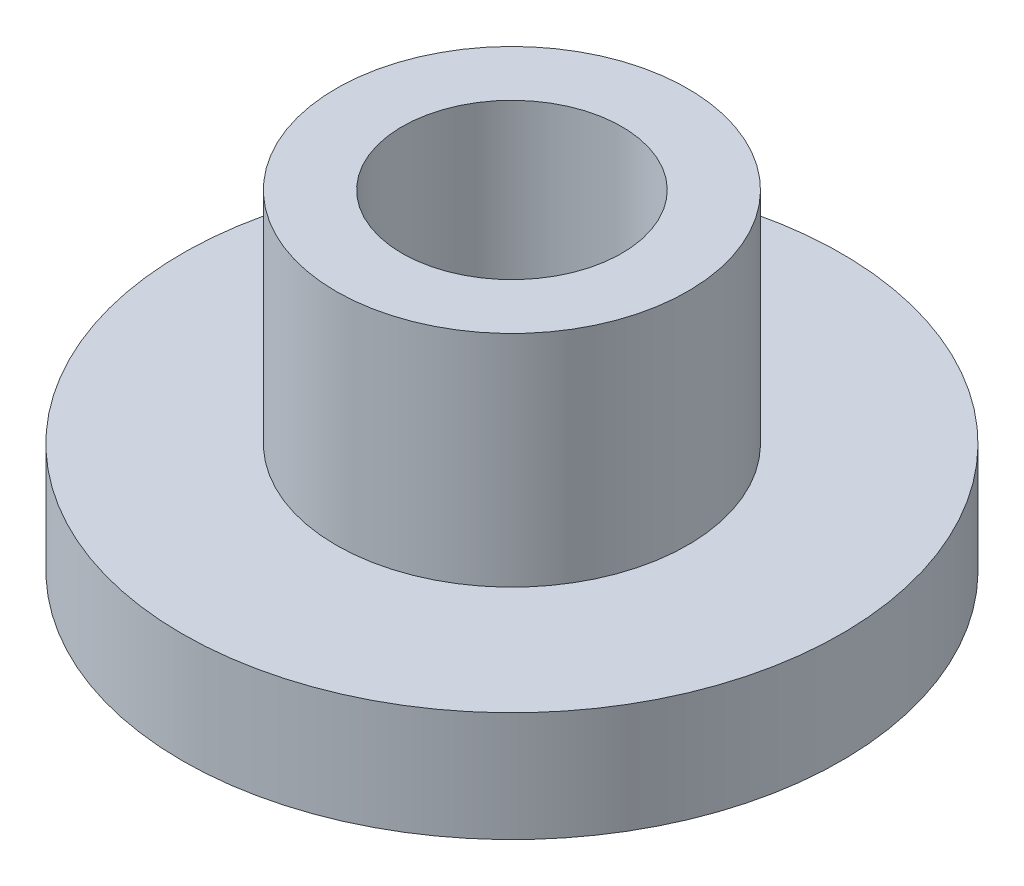
ISO-10303-21;
HEADER;
FILE_DESCRIPTION(('STEP AP214'),'2;1');
FILE_NAME('part.step','',(''),(''),'','','');
FILE_SCHEMA(('AUTOMOTIVE_DESIGN { 1 0 10303 214 1 1 1 1 }'));
ENDSEC;
DATA;
#1=APPLICATION_CONTEXT('core data for automotive mechanical design processes');
#2=APPLICATION_PROTOCOL_DEFINITION('international standard','automotive_design',2000,#1);
#3=PRODUCT_CONTEXT('',#1,'mechanical');
#4=PRODUCT('Part','Part','',(#3));
#5=PRODUCT_RELATED_PRODUCT_CATEGORY('part','',(#4));
#6=PRODUCT_DEFINITION_FORMATION('','',#4);
#7=PRODUCT_DEFINITION_CONTEXT('part definition',#1,'design');
#8=PRODUCT_DEFINITION('design','',#6,#7);
#9=PRODUCT_DEFINITION_SHAPE('','',#8);
#10=(LENGTH_UNIT() NAMED_UNIT(*) SI_UNIT(.MILLI.,.METRE.));
#11=(NAMED_UNIT(*) PLANE_ANGLE_UNIT() SI_UNIT($,.RADIAN.));
#12=(NAMED_UNIT(*) SI_UNIT($,.STERADIAN.) SOLID_ANGLE_UNIT());
#13=UNCERTAINTY_MEASURE_WITH_UNIT(LENGTH_MEASURE(1.E-05),#10,'distance_accuracy_value','');
#14=(GEOMETRIC_REPRESENTATION_CONTEXT(3) GLOBAL_UNCERTAINTY_ASSIGNED_CONTEXT((#13)) GLOBAL_UNIT_ASSIGNED_CONTEXT((#10,
#11,#12)) REPRESENTATION_CONTEXT('',''));
#15=CARTESIAN_POINT('',(0.,0.,0.));
#16=DIRECTION('',(0.,0.,1.));
#17=DIRECTION('',(1.,0.,0.));
#18=AXIS2_PLACEMENT_3D('',#15,#16,#17);
#19=CARTESIAN_POINT('',(0.,5.,0.));
#20=DIRECTION('',(0.,-1.,0.));
#21=DIRECTION('',(0.,0.,-1.));
#22=AXIS2_PLACEMENT_3D('',#19,#20,#21);
#23=CYLINDRICAL_SURFACE('',#22,15.);
#24=CARTESIAN_POINT('',(0.,5.,0.));
#25=DIRECTION('',(0.,1.,0.));
#26=DIRECTION('',(0.,0.,1.));
#27=AXIS2_PLACEMENT_3D('',#24,#25,#26);
#28=CIRCLE('',#27,15.);
#29=CARTESIAN_POINT('',(0.,5.,15.));
#30=VERTEX_POINT('',#29);
#31=EDGE_CURVE('E37',#30,#30,#28,.T.);
#32=ORIENTED_EDGE('',*,*,#31,.F.);
#33=EDGE_LOOP('',(#32));
#34=FACE_BOUND('',#33,.T.);
#35=CARTESIAN_POINT('',(0.,0.,0.));
#36=DIRECTION('',(0.,1.,0.));
#37=DIRECTION('',(0.,0.,1.));
#38=AXIS2_PLACEMENT_3D('',#35,#36,#37);
#39=CIRCLE('',#38,15.);
#40=CARTESIAN_POINT('',(0.,0.,15.));
#41=VERTEX_POINT('',#40);
#42=EDGE_CURVE('E41',#41,#41,#39,.T.);
#43=ORIENTED_EDGE('',*,*,#42,.T.);
#44=EDGE_LOOP('',(#43));
#45=FACE_BOUND('',#44,.T.);
#46=ADVANCED_FACE('F31',(#34,#45),#23,.T.);
#47=CARTESIAN_POINT('',(0.,5.,0.));
#48=DIRECTION('',(0.,1.,0.));
#49=DIRECTION('',(0.,0.,1.));
#50=AXIS2_PLACEMENT_3D('',#47,#48,#49);
#51=PLANE('',#50);
#52=CARTESIAN_POINT('',(0.,5.,0.));
#53=DIRECTION('',(0.,1.,0.));
#54=DIRECTION('',(0.,0.,1.));
#55=AXIS2_PLACEMENT_3D('',#52,#53,#54);
#56=CIRCLE('',#55,8.);
#57=CARTESIAN_POINT('',(0.,5.,8.));
#58=VERTEX_POINT('',#57);
#59=EDGE_CURVE('E48',#58,#58,#56,.T.);
#60=ORIENTED_EDGE('',*,*,#59,.F.);
#61=EDGE_LOOP('',(#60));
#62=FACE_BOUND('',#61,.T.);
#63=ORIENTED_EDGE('',*,*,#31,.T.);
#64=EDGE_LOOP('',(#63));
#65=FACE_BOUND('',#64,.T.);
#66=ADVANCED_FACE('F71',(#62,#65),#51,.T.);
#67=CARTESIAN_POINT('',(0.,0.,0.));
#68=DIRECTION('',(0.,1.,0.));
#69=DIRECTION('',(0.,0.,1.));
#70=AXIS2_PLACEMENT_3D('',#67,#68,#69);
#71=PLANE('',#70);
#72=ORIENTED_EDGE('',*,*,#42,.F.);
#73=EDGE_LOOP('',(#72));
#74=FACE_BOUND('',#73,.T.);
#75=ADVANCED_FACE('F62',(#74),#71,.F.);
#76=CARTESIAN_POINT('',(0.,15.,0.));
#77=DIRECTION('',(0.,1.,0.));
#78=DIRECTION('',(0.,0.,1.));
#79=AXIS2_PLACEMENT_3D('',#76,#77,#78);
#80=PLANE('',#79);
#81=CARTESIAN_POINT('',(0.,15.,0.));
#82=DIRECTION('',(0.,1.,0.));
#83=DIRECTION('',(0.,0.,1.));
#84=AXIS2_PLACEMENT_3D('',#81,#82,#83);
#85=CIRCLE('',#84,8.);
#86=CARTESIAN_POINT('',(0.,15.,8.));
#87=VERTEX_POINT('',#86);
#88=EDGE_CURVE('E46',#87,#87,#85,.T.);
#89=ORIENTED_EDGE('',*,*,#88,.T.);
#90=EDGE_LOOP('',(#89));
#91=FACE_BOUND('',#90,.T.);
#92=CARTESIAN_POINT('',(0.,15.,0.));
#93=DIRECTION('',(0.,1.,0.));
#94=DIRECTION('',(0.,0.,1.));
#95=AXIS2_PLACEMENT_3D('',#92,#93,#94);
#96=CIRCLE('',#95,5.);
#97=CARTESIAN_POINT('',(0.,15.,5.));
#98=VERTEX_POINT('',#97);
#99=EDGE_CURVE('E51',#98,#98,#96,.T.);
#100=ORIENTED_EDGE('',*,*,#99,.F.);
#101=EDGE_LOOP('',(#100));
#102=FACE_BOUND('',#101,.T.);
#103=ADVANCED_FACE('F59',(#91,#102),#80,.T.);
#104=CARTESIAN_POINT('',(0.,15.,0.));
#105=DIRECTION('',(0.,-1.,0.));
#106=DIRECTION('',(0.,0.,-1.));
#107=AXIS2_PLACEMENT_3D('',#104,#105,#106);
#108=CYLINDRICAL_SURFACE('',#107,8.);
#109=ORIENTED_EDGE('',*,*,#88,.F.);
#110=EDGE_LOOP('',(#109));
#111=FACE_BOUND('',#110,.T.);
#112=ORIENTED_EDGE('',*,*,#59,.T.);
#113=EDGE_LOOP('',(#112));
#114=FACE_BOUND('',#113,.T.);
#115=ADVANCED_FACE('F61',(#111,#114),#108,.T.);
#116=CARTESIAN_POINT('',(0.,15.,0.));
#117=DIRECTION('',(0.,-1.,0.));
#118=DIRECTION('',(0.,0.,-1.));
#119=AXIS2_PLACEMENT_3D('',#116,#117,#118);
#120=CYLINDRICAL_SURFACE('',#119,5.);
#121=ORIENTED_EDGE('',*,*,#99,.T.);
#122=EDGE_LOOP('',(#121));
#123=FACE_BOUND('',#122,.T.);
#124=CARTESIAN_POINT('',(0.,5.,0.));
#125=DIRECTION('',(0.,1.,0.));
#126=DIRECTION('',(0.,0.,1.));
#127=AXIS2_PLACEMENT_3D('',#124,#125,#126);
#128=CIRCLE('',#127,5.);
#129=CARTESIAN_POINT('',(0.,5.,5.));
#130=VERTEX_POINT('',#129);
#131=EDGE_CURVE('E10',#130,#130,#128,.F.);
#132=ORIENTED_EDGE('',*,*,#131,.T.);
#133=EDGE_LOOP('',(#132));
#134=FACE_BOUND('',#133,.T.);
#135=ADVANCED_FACE('F57',(#123,#134),#120,.F.);
#136=ORIENTED_EDGE('',*,*,#131,.F.);
#137=EDGE_LOOP('',(#136));
#138=FACE_BOUND('',#137,.T.);
#139=ADVANCED_FACE('F81',(#138),#51,.T.);
#140=CLOSED_SHELL('',(#46,#66,#75,#103,#115,#135,#139));
#141=MANIFOLD_SOLID_BREP('B2',#140);
#142=ADVANCED_BREP_SHAPE_REPRESENTATION('',(#18,#141),#14);
#143=SHAPE_DEFINITION_REPRESENTATION(#9,#142);
ENDSEC;
END-ISO-10303-21;
